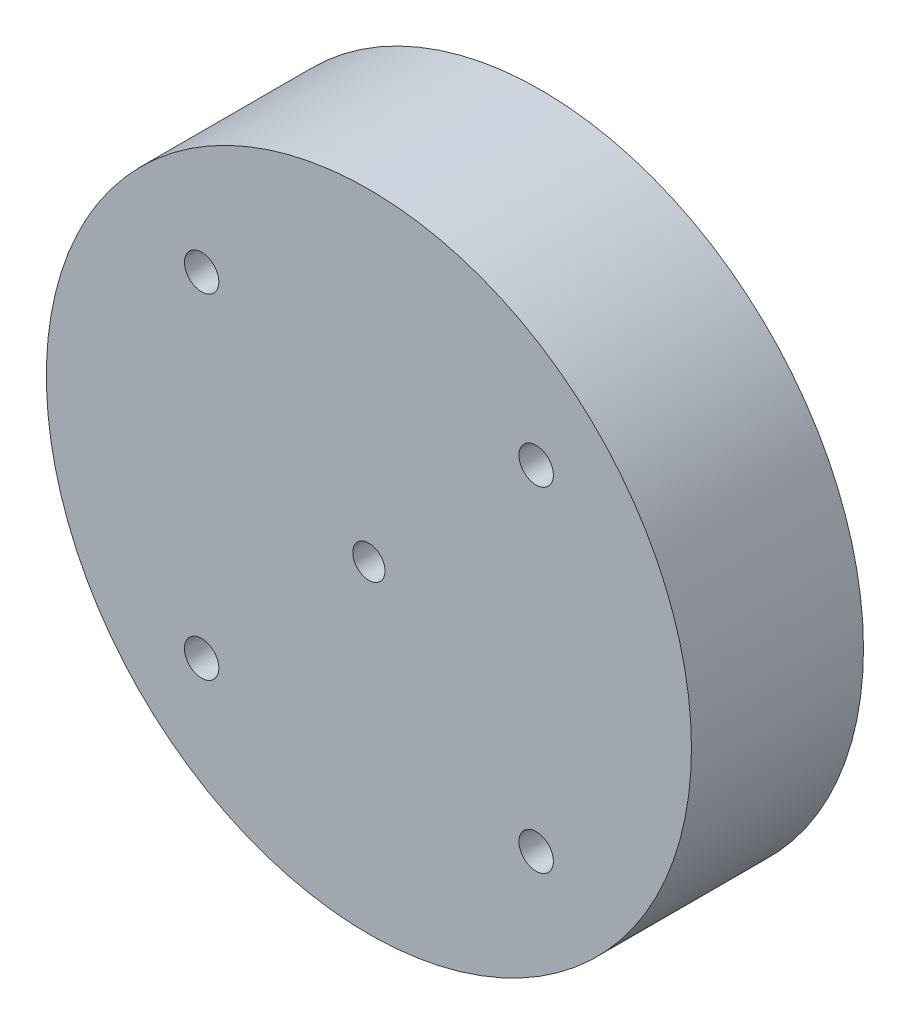
ISO-10303-21;
HEADER;
FILE_DESCRIPTION(('STEP AP214'),'2;1');
FILE_NAME('part.step','',(''),(''),'','','');
FILE_SCHEMA(('AUTOMOTIVE_DESIGN { 1 0 10303 214 1 1 1 1 }'));
ENDSEC;
DATA;
#1=APPLICATION_CONTEXT('core data for automotive mechanical design processes');
#2=APPLICATION_PROTOCOL_DEFINITION('international standard','automotive_design',2000,#1);
#3=PRODUCT_CONTEXT('',#1,'mechanical');
#4=PRODUCT('Part','Part','',(#3));
#5=PRODUCT_RELATED_PRODUCT_CATEGORY('part','',(#4));
#6=PRODUCT_DEFINITION_FORMATION('','',#4);
#7=PRODUCT_DEFINITION_CONTEXT('part definition',#1,'design');
#8=PRODUCT_DEFINITION('design','',#6,#7);
#9=PRODUCT_DEFINITION_SHAPE('','',#8);
#10=(LENGTH_UNIT() NAMED_UNIT(*) SI_UNIT(.MILLI.,.METRE.));
#11=(NAMED_UNIT(*) PLANE_ANGLE_UNIT() SI_UNIT($,.RADIAN.));
#12=(NAMED_UNIT(*) SI_UNIT($,.STERADIAN.) SOLID_ANGLE_UNIT());
#13=UNCERTAINTY_MEASURE_WITH_UNIT(LENGTH_MEASURE(1.E-05),#10,'distance_accuracy_value','');
#14=(GEOMETRIC_REPRESENTATION_CONTEXT(3) GLOBAL_UNCERTAINTY_ASSIGNED_CONTEXT((#13)) GLOBAL_UNIT_ASSIGNED_CONTEXT((#10,
#11,#12)) REPRESENTATION_CONTEXT('',''));
#15=CARTESIAN_POINT('',(0.,0.,0.));
#16=DIRECTION('',(0.,0.,1.));
#17=DIRECTION('',(1.,0.,0.));
#18=AXIS2_PLACEMENT_3D('',#15,#16,#17);
#19=CARTESIAN_POINT('',(0.,0.,16.));
#20=DIRECTION('',(0.,0.,1.));
#21=DIRECTION('',(1.,0.,0.));
#22=AXIS2_PLACEMENT_3D('',#19,#20,#21);
#23=PLANE('',#22);
#24=CARTESIAN_POINT('',(15.556349186104,-15.556349186104,16.));
#25=DIRECTION('',(0.,0.,1.));
#26=DIRECTION('',(1.,0.,0.));
#27=AXIS2_PLACEMENT_3D('',#24,#25,#26);
#28=CIRCLE('',#27,1.59999999999999);
#29=CARTESIAN_POINT('',(17.156349186104,-15.556349186104,16.));
#30=VERTEX_POINT('',#29);
#31=EDGE_CURVE('E65',#30,#30,#28,.F.);
#32=ORIENTED_EDGE('',*,*,#31,.T.);
#33=EDGE_LOOP('',(#32));
#34=FACE_BOUND('',#33,.T.);
#35=CARTESIAN_POINT('',(-15.556349186104,-15.556349186104,16.));
#36=DIRECTION('',(0.,0.,1.));
#37=DIRECTION('',(1.,0.,0.));
#38=AXIS2_PLACEMENT_3D('',#35,#36,#37);
#39=CIRCLE('',#38,1.6);
#40=CARTESIAN_POINT('',(-13.956349186104,-15.556349186104,16.));
#41=VERTEX_POINT('',#40);
#42=EDGE_CURVE('E68',#41,#41,#39,.F.);
#43=ORIENTED_EDGE('',*,*,#42,.T.);
#44=EDGE_LOOP('',(#43));
#45=FACE_BOUND('',#44,.T.);
#46=CARTESIAN_POINT('',(-15.556349186104,15.556349186104,16.));
#47=DIRECTION('',(0.,0.,1.));
#48=DIRECTION('',(1.,0.,0.));
#49=AXIS2_PLACEMENT_3D('',#46,#47,#48);
#50=CIRCLE('',#49,1.6);
#51=CARTESIAN_POINT('',(-13.956349186104,15.556349186104,16.));
#52=VERTEX_POINT('',#51);
#53=EDGE_CURVE('E71',#52,#52,#50,.F.);
#54=ORIENTED_EDGE('',*,*,#53,.T.);
#55=EDGE_LOOP('',(#54));
#56=FACE_BOUND('',#55,.T.);
#57=CARTESIAN_POINT('',(15.556349186104,15.556349186104,16.));
#58=DIRECTION('',(0.,0.,1.));
#59=DIRECTION('',(1.,0.,0.));
#60=AXIS2_PLACEMENT_3D('',#57,#58,#59);
#61=CIRCLE('',#60,1.6);
#62=CARTESIAN_POINT('',(17.156349186104,15.556349186104,16.));
#63=VERTEX_POINT('',#62);
#64=EDGE_CURVE('E80',#63,#63,#61,.F.);
#65=ORIENTED_EDGE('',*,*,#64,.T.);
#66=EDGE_LOOP('',(#65));
#67=FACE_BOUND('',#66,.T.);
#68=CARTESIAN_POINT('',(0.,0.,16.));
#69=DIRECTION('',(0.,0.,1.));
#70=DIRECTION('',(1.,0.,0.));
#71=AXIS2_PLACEMENT_3D('',#68,#69,#70);
#72=CIRCLE('',#71,30.);
#73=CARTESIAN_POINT('',(30.,0.,16.));
#74=VERTEX_POINT('',#73);
#75=EDGE_CURVE('E10',#74,#74,#72,.T.);
#76=ORIENTED_EDGE('',*,*,#75,.T.);
#77=EDGE_LOOP('',(#76));
#78=FACE_BOUND('',#77,.T.);
#79=CARTESIAN_POINT('',(0.,0.,16.));
#80=DIRECTION('',(0.,0.,1.));
#81=DIRECTION('',(1.,0.,0.));
#82=AXIS2_PLACEMENT_3D('',#79,#80,#81);
#83=CIRCLE('',#82,1.5);
#84=CARTESIAN_POINT('',(1.5,0.,16.));
#85=VERTEX_POINT('',#84);
#86=EDGE_CURVE('E57',#85,#85,#83,.T.);
#87=ORIENTED_EDGE('',*,*,#86,.F.);
#88=EDGE_LOOP('',(#87));
#89=FACE_BOUND('',#88,.T.);
#90=ADVANCED_FACE('F43',(#34,#45,#56,#67,#78,#89),#23,.T.);
#91=CARTESIAN_POINT('',(0.,0.,0.));
#92=DIRECTION('',(0.,0.,1.));
#93=DIRECTION('',(1.,0.,0.));
#94=AXIS2_PLACEMENT_3D('',#91,#92,#93);
#95=PLANE('',#94);
#96=CARTESIAN_POINT('',(15.556349186104,-15.556349186104,0.));
#97=DIRECTION('',(0.,0.,1.));
#98=DIRECTION('',(1.,0.,0.));
#99=AXIS2_PLACEMENT_3D('',#96,#97,#98);
#100=CIRCLE('',#99,1.59999999999999);
#101=CARTESIAN_POINT('',(17.156349186104,-15.556349186104,0.));
#102=VERTEX_POINT('',#101);
#103=EDGE_CURVE('E88',#102,#102,#100,.T.);
#104=ORIENTED_EDGE('',*,*,#103,.T.);
#105=EDGE_LOOP('',(#104));
#106=FACE_BOUND('',#105,.T.);
#107=CARTESIAN_POINT('',(-15.556349186104,-15.556349186104,0.));
#108=DIRECTION('',(0.,0.,1.));
#109=DIRECTION('',(1.,0.,0.));
#110=AXIS2_PLACEMENT_3D('',#107,#108,#109);
#111=CIRCLE('',#110,1.6);
#112=CARTESIAN_POINT('',(-13.956349186104,-15.556349186104,0.));
#113=VERTEX_POINT('',#112);
#114=EDGE_CURVE('E89',#113,#113,#111,.T.);
#115=ORIENTED_EDGE('',*,*,#114,.T.);
#116=EDGE_LOOP('',(#115));
#117=FACE_BOUND('',#116,.T.);
#118=CARTESIAN_POINT('',(-15.556349186104,15.556349186104,0.));
#119=DIRECTION('',(0.,0.,1.));
#120=DIRECTION('',(1.,0.,0.));
#121=AXIS2_PLACEMENT_3D('',#118,#119,#120);
#122=CIRCLE('',#121,1.6);
#123=CARTESIAN_POINT('',(-13.956349186104,15.556349186104,0.));
#124=VERTEX_POINT('',#123);
#125=EDGE_CURVE('E82',#124,#124,#122,.T.);
#126=ORIENTED_EDGE('',*,*,#125,.T.);
#127=EDGE_LOOP('',(#126));
#128=FACE_BOUND('',#127,.T.);
#129=CARTESIAN_POINT('',(15.556349186104,15.556349186104,0.));
#130=DIRECTION('',(0.,0.,1.));
#131=DIRECTION('',(1.,0.,0.));
#132=AXIS2_PLACEMENT_3D('',#129,#130,#131);
#133=CIRCLE('',#132,1.6);
#134=CARTESIAN_POINT('',(17.156349186104,15.556349186104,0.));
#135=VERTEX_POINT('',#134);
#136=EDGE_CURVE('E84',#135,#135,#133,.T.);
#137=ORIENTED_EDGE('',*,*,#136,.T.);
#138=EDGE_LOOP('',(#137));
#139=FACE_BOUND('',#138,.T.);
#140=CARTESIAN_POINT('',(0.,0.,0.));
#141=DIRECTION('',(0.,0.,1.));
#142=DIRECTION('',(1.,0.,0.));
#143=AXIS2_PLACEMENT_3D('',#140,#141,#142);
#144=CIRCLE('',#143,30.);
#145=CARTESIAN_POINT('',(30.,0.,0.));
#146=VERTEX_POINT('',#145);
#147=EDGE_CURVE('E50',#146,#146,#144,.T.);
#148=ORIENTED_EDGE('',*,*,#147,.F.);
#149=EDGE_LOOP('',(#148));
#150=FACE_BOUND('',#149,.T.);
#151=CARTESIAN_POINT('',(0.,0.,0.));
#152=DIRECTION('',(0.,0.,1.));
#153=DIRECTION('',(1.,0.,0.));
#154=AXIS2_PLACEMENT_3D('',#151,#152,#153);
#155=CIRCLE('',#154,1.5);
#156=CARTESIAN_POINT('',(1.5,0.,0.));
#157=VERTEX_POINT('',#156);
#158=EDGE_CURVE('E59',#157,#157,#155,.T.);
#159=ORIENTED_EDGE('',*,*,#158,.T.);
#160=EDGE_LOOP('',(#159));
#161=FACE_BOUND('',#160,.T.);
#162=ADVANCED_FACE('F98',(#106,#117,#128,#139,#150,#161),#95,.F.);
#163=CARTESIAN_POINT('',(0.,0.,16.));
#164=DIRECTION('',(0.,0.,-1.));
#165=DIRECTION('',(-1.,0.,0.));
#166=AXIS2_PLACEMENT_3D('',#163,#164,#165);
#167=CYLINDRICAL_SURFACE('',#166,30.);
#168=ORIENTED_EDGE('',*,*,#75,.F.);
#169=EDGE_LOOP('',(#168));
#170=FACE_BOUND('',#169,.T.);
#171=ORIENTED_EDGE('',*,*,#147,.T.);
#172=EDGE_LOOP('',(#171));
#173=FACE_BOUND('',#172,.T.);
#174=ADVANCED_FACE('F44',(#170,#173),#167,.T.);
#175=CARTESIAN_POINT('',(0.,0.,16.));
#176=DIRECTION('',(0.,0.,-1.));
#177=DIRECTION('',(-1.,0.,0.));
#178=AXIS2_PLACEMENT_3D('',#175,#176,#177);
#179=CYLINDRICAL_SURFACE('',#178,1.5);
#180=ORIENTED_EDGE('',*,*,#86,.T.);
#181=EDGE_LOOP('',(#180));
#182=FACE_BOUND('',#181,.T.);
#183=ORIENTED_EDGE('',*,*,#158,.F.);
#184=EDGE_LOOP('',(#183));
#185=FACE_BOUND('',#184,.T.);
#186=ADVANCED_FACE('F111',(#182,#185),#179,.F.);
#187=CARTESIAN_POINT('',(15.556349186104,15.556349186104,17.));
#188=DIRECTION('',(0.,0.,-1.));
#189=DIRECTION('',(-1.,0.,0.));
#190=AXIS2_PLACEMENT_3D('',#187,#188,#189);
#191=CYLINDRICAL_SURFACE('',#190,1.6);
#192=ORIENTED_EDGE('',*,*,#64,.F.);
#193=EDGE_LOOP('',(#192));
#194=FACE_BOUND('',#193,.T.);
#195=ORIENTED_EDGE('',*,*,#136,.F.);
#196=EDGE_LOOP('',(#195));
#197=FACE_BOUND('',#196,.T.);
#198=ADVANCED_FACE('F102',(#194,#197),#191,.F.);
#199=CARTESIAN_POINT('',(-15.556349186104,15.556349186104,17.));
#200=DIRECTION('',(0.,0.,-1.));
#201=DIRECTION('',(-1.,0.,0.));
#202=AXIS2_PLACEMENT_3D('',#199,#200,#201);
#203=CYLINDRICAL_SURFACE('',#202,1.6);
#204=ORIENTED_EDGE('',*,*,#53,.F.);
#205=EDGE_LOOP('',(#204));
#206=FACE_BOUND('',#205,.T.);
#207=ORIENTED_EDGE('',*,*,#125,.F.);
#208=EDGE_LOOP('',(#207));
#209=FACE_BOUND('',#208,.T.);
#210=ADVANCED_FACE('F101',(#206,#209),#203,.F.);
#211=CARTESIAN_POINT('',(-15.556349186104,-15.556349186104,17.));
#212=DIRECTION('',(0.,0.,-1.));
#213=DIRECTION('',(-1.,0.,0.));
#214=AXIS2_PLACEMENT_3D('',#211,#212,#213);
#215=CYLINDRICAL_SURFACE('',#214,1.6);
#216=ORIENTED_EDGE('',*,*,#42,.F.);
#217=EDGE_LOOP('',(#216));
#218=FACE_BOUND('',#217,.T.);
#219=ORIENTED_EDGE('',*,*,#114,.F.);
#220=EDGE_LOOP('',(#219));
#221=FACE_BOUND('',#220,.T.);
#222=ADVANCED_FACE('F103',(#218,#221),#215,.F.);
#223=CARTESIAN_POINT('',(15.556349186104,-15.556349186104,17.));
#224=DIRECTION('',(0.,0.,-1.));
#225=DIRECTION('',(-1.,0.,0.));
#226=AXIS2_PLACEMENT_3D('',#223,#224,#225);
#227=CYLINDRICAL_SURFACE('',#226,1.59999999999999);
#228=ORIENTED_EDGE('',*,*,#31,.F.);
#229=EDGE_LOOP('',(#228));
#230=FACE_BOUND('',#229,.T.);
#231=ORIENTED_EDGE('',*,*,#103,.F.);
#232=EDGE_LOOP('',(#231));
#233=FACE_BOUND('',#232,.T.);
#234=ADVANCED_FACE('F112',(#230,#233),#227,.F.);
#235=CLOSED_SHELL('',(#90,#162,#174,#186,#198,#210,#222,#234));
#236=MANIFOLD_SOLID_BREP('B2',#235);
#237=ADVANCED_BREP_SHAPE_REPRESENTATION('',(#18,#236),#14);
#238=SHAPE_DEFINITION_REPRESENTATION(#9,#237);
ENDSEC;
END-ISO-10303-21;
